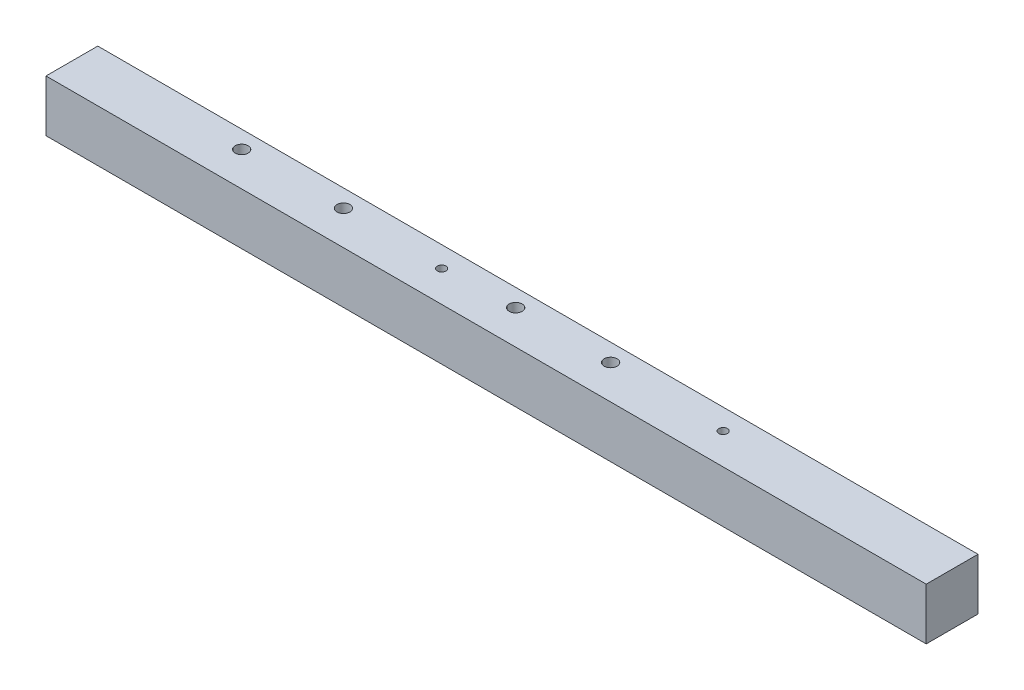
ISO-10303-21;
HEADER;
FILE_DESCRIPTION(('STEP AP214'),'2;1');
FILE_NAME('part.step','',(''),(''),'','','');
FILE_SCHEMA(('AUTOMOTIVE_DESIGN { 1 0 10303 214 1 1 1 1 }'));
ENDSEC;
DATA;
#1=APPLICATION_CONTEXT('core data for automotive mechanical design processes');
#2=APPLICATION_PROTOCOL_DEFINITION('international standard','automotive_design',2000,#1);
#3=PRODUCT_CONTEXT('',#1,'mechanical');
#4=PRODUCT('Part','Part','',(#3));
#5=PRODUCT_RELATED_PRODUCT_CATEGORY('part','',(#4));
#6=PRODUCT_DEFINITION_FORMATION('','',#4);
#7=PRODUCT_DEFINITION_CONTEXT('part definition',#1,'design');
#8=PRODUCT_DEFINITION('design','',#6,#7);
#9=PRODUCT_DEFINITION_SHAPE('','',#8);
#10=(LENGTH_UNIT() NAMED_UNIT(*) SI_UNIT(.MILLI.,.METRE.));
#11=(NAMED_UNIT(*) PLANE_ANGLE_UNIT() SI_UNIT($,.RADIAN.));
#12=(NAMED_UNIT(*) SI_UNIT($,.STERADIAN.) SOLID_ANGLE_UNIT());
#13=UNCERTAINTY_MEASURE_WITH_UNIT(LENGTH_MEASURE(1.E-05),#10,'distance_accuracy_value','');
#14=(GEOMETRIC_REPRESENTATION_CONTEXT(3) GLOBAL_UNCERTAINTY_ASSIGNED_CONTEXT((#13)) GLOBAL_UNIT_ASSIGNED_CONTEXT((#10,
#11,#12)) REPRESENTATION_CONTEXT('',''));
#15=CARTESIAN_POINT('',(0.,0.,0.));
#16=DIRECTION('',(0.,0.,1.));
#17=DIRECTION('',(1.,0.,0.));
#18=AXIS2_PLACEMENT_3D('',#15,#16,#17);
#19=CARTESIAN_POINT('',(0.,38.1,0.));
#20=DIRECTION('',(0.,-1.,0.));
#21=DIRECTION('',(0.,0.,-1.));
#22=AXIS2_PLACEMENT_3D('',#19,#20,#21);
#23=PLANE('',#22);
#24=DIRECTION('',(0.,0.,1.));
#25=VECTOR('',#24,1.);
#26=CARTESIAN_POINT('',(0.,38.1,0.));
#27=LINE('',#26,#25);
#28=CARTESIAN_POINT('',(0.,38.1,-38.1));
#29=VERTEX_POINT('',#28);
#30=CARTESIAN_POINT('',(0.,38.1,0.));
#31=VERTEX_POINT('',#30);
#32=EDGE_CURVE('E91',#29,#31,#27,.T.);
#33=ORIENTED_EDGE('',*,*,#32,.T.);
#34=DIRECTION('',(1.,0.,0.));
#35=VECTOR('',#34,1.);
#36=CARTESIAN_POINT('',(0.,38.1,0.));
#37=LINE('',#36,#35);
#38=CARTESIAN_POINT('',(647.7,38.1,0.));
#39=VERTEX_POINT('',#38);
#40=EDGE_CURVE('E86',#31,#39,#37,.T.);
#41=ORIENTED_EDGE('',*,*,#40,.T.);
#42=DIRECTION('',(0.,0.,-1.));
#43=VECTOR('',#42,1.);
#44=CARTESIAN_POINT('',(647.7,38.1,0.));
#45=LINE('',#44,#43);
#46=CARTESIAN_POINT('',(647.7,38.1,-38.1));
#47=VERTEX_POINT('',#46);
#48=EDGE_CURVE('E89',#39,#47,#45,.T.);
#49=ORIENTED_EDGE('',*,*,#48,.T.);
#50=DIRECTION('',(-1.,0.,0.));
#51=VECTOR('',#50,1.);
#52=CARTESIAN_POINT('',(0.,38.1,-38.1));
#53=LINE('',#52,#51);
#54=EDGE_CURVE('E56',#47,#29,#53,.T.);
#55=ORIENTED_EDGE('',*,*,#54,.T.);
#56=EDGE_LOOP('',(#33,#41,#49,#55));
#57=FACE_BOUND('',#56,.T.);
#58=CARTESIAN_POINT('',(118.802175491191,38.1,-25.146));
#59=DIRECTION('',(0.,1.,0.));
#60=DIRECTION('',(0.,0.,1.));
#61=AXIS2_PLACEMENT_3D('',#58,#59,#60);
#62=CIRCLE('',#61,4.7625);
#63=CARTESIAN_POINT('',(118.802175491191,38.1,-29.9085));
#64=VERTEX_POINT('',#63);
#65=EDGE_CURVE('E106',#64,#64,#62,.T.);
#66=ORIENTED_EDGE('',*,*,#65,.F.);
#67=EDGE_LOOP('',(#66));
#68=FACE_BOUND('',#67,.T.);
#69=CARTESIAN_POINT('',(193.732175491191,38.1,-25.146));
#70=DIRECTION('',(0.,1.,0.));
#71=DIRECTION('',(0.,0.,1.));
#72=AXIS2_PLACEMENT_3D('',#69,#70,#71);
#73=CIRCLE('',#72,4.76250000000001);
#74=CARTESIAN_POINT('',(193.732175491191,38.1,-29.9085));
#75=VERTEX_POINT('',#74);
#76=EDGE_CURVE('E121',#75,#75,#73,.T.);
#77=ORIENTED_EDGE('',*,*,#76,.F.);
#78=EDGE_LOOP('',(#77));
#79=FACE_BOUND('',#78,.T.);
#80=CARTESIAN_POINT('',(320.470555491191,38.1,-25.146));
#81=DIRECTION('',(0.,1.,0.));
#82=DIRECTION('',(0.,0.,1.));
#83=AXIS2_PLACEMENT_3D('',#80,#81,#82);
#84=CIRCLE('',#83,4.76250000000001);
#85=CARTESIAN_POINT('',(320.470555491191,38.1,-29.9085));
#86=VERTEX_POINT('',#85);
#87=EDGE_CURVE('E127',#86,#86,#84,.T.);
#88=ORIENTED_EDGE('',*,*,#87,.F.);
#89=EDGE_LOOP('',(#88));
#90=FACE_BOUND('',#89,.T.);
#91=CARTESIAN_POINT('',(390.320555491191,38.1,-25.146));
#92=DIRECTION('',(0.,1.,0.));
#93=DIRECTION('',(0.,0.,1.));
#94=AXIS2_PLACEMENT_3D('',#91,#92,#93);
#95=CIRCLE('',#94,4.76250000000001);
#96=CARTESIAN_POINT('',(390.320555491191,38.1,-29.9085));
#97=VERTEX_POINT('',#96);
#98=EDGE_CURVE('E133',#97,#97,#95,.T.);
#99=ORIENTED_EDGE('',*,*,#98,.F.);
#100=EDGE_LOOP('',(#99));
#101=FACE_BOUND('',#100,.T.);
#102=CARTESIAN_POINT('',(475.391073092,38.1,-22.8375768800001));
#103=DIRECTION('',(0.,1.,0.));
#104=DIRECTION('',(0.,0.,1.));
#105=AXIS2_PLACEMENT_3D('',#102,#103,#104);
#106=CIRCLE('',#105,3.17499999999997);
#107=CARTESIAN_POINT('',(475.391073092,38.1,-26.0125768800001));
#108=VERTEX_POINT('',#107);
#109=EDGE_CURVE('E139',#108,#108,#106,.T.);
#110=ORIENTED_EDGE('',*,*,#109,.F.);
#111=EDGE_LOOP('',(#110));
#112=FACE_BOUND('',#111,.T.);
#113=CARTESIAN_POINT('',(268.254073092,38.1,-22.83757688));
#114=DIRECTION('',(0.,1.,0.));
#115=DIRECTION('',(0.,0.,1.));
#116=AXIS2_PLACEMENT_3D('',#113,#114,#115);
#117=CIRCLE('',#116,3.17499999999997);
#118=CARTESIAN_POINT('',(268.254073092,38.1,-26.01257688));
#119=VERTEX_POINT('',#118);
#120=EDGE_CURVE('E145',#119,#119,#117,.T.);
#121=ORIENTED_EDGE('',*,*,#120,.F.);
#122=EDGE_LOOP('',(#121));
#123=FACE_BOUND('',#122,.T.);
#124=ADVANCED_FACE('F39',(#57,#68,#79,#90,#101,#112,#123),#23,.F.);
#125=CARTESIAN_POINT('',(0.,0.,0.));
#126=DIRECTION('',(0.,-1.,0.));
#127=DIRECTION('',(0.,0.,-1.));
#128=AXIS2_PLACEMENT_3D('',#125,#126,#127);
#129=PLANE('',#128);
#130=CARTESIAN_POINT('',(475.391073092,0.,-22.8375768800001));
#131=DIRECTION('',(0.,1.,0.));
#132=DIRECTION('',(0.,0.,1.));
#133=AXIS2_PLACEMENT_3D('',#130,#131,#132);
#134=CIRCLE('',#133,3.17499999999997);
#135=CARTESIAN_POINT('',(475.391073092,0.,-26.0125768800001));
#136=VERTEX_POINT('',#135);
#137=EDGE_CURVE('E142',#136,#136,#134,.T.);
#138=ORIENTED_EDGE('',*,*,#137,.T.);
#139=EDGE_LOOP('',(#138));
#140=FACE_BOUND('',#139,.T.);
#141=CARTESIAN_POINT('',(320.470555491191,0.,-25.146));
#142=DIRECTION('',(0.,1.,0.));
#143=DIRECTION('',(0.,0.,1.));
#144=AXIS2_PLACEMENT_3D('',#141,#142,#143);
#145=CIRCLE('',#144,4.76250000000001);
#146=CARTESIAN_POINT('',(320.470555491191,0.,-29.9085));
#147=VERTEX_POINT('',#146);
#148=EDGE_CURVE('E130',#147,#147,#145,.T.);
#149=ORIENTED_EDGE('',*,*,#148,.T.);
#150=EDGE_LOOP('',(#149));
#151=FACE_BOUND('',#150,.T.);
#152=CARTESIAN_POINT('',(118.802175491191,0.,-25.146));
#153=DIRECTION('',(0.,1.,0.));
#154=DIRECTION('',(0.,0.,1.));
#155=AXIS2_PLACEMENT_3D('',#152,#153,#154);
#156=CIRCLE('',#155,4.7625);
#157=CARTESIAN_POINT('',(118.802175491191,0.,-29.9085));
#158=VERTEX_POINT('',#157);
#159=EDGE_CURVE('E118',#158,#158,#156,.T.);
#160=ORIENTED_EDGE('',*,*,#159,.T.);
#161=EDGE_LOOP('',(#160));
#162=FACE_BOUND('',#161,.T.);
#163=DIRECTION('',(0.,0.,1.));
#164=VECTOR('',#163,1.);
#165=CARTESIAN_POINT('',(0.,0.,0.));
#166=LINE('',#165,#164);
#167=CARTESIAN_POINT('',(0.,0.,-38.1));
#168=VERTEX_POINT('',#167);
#169=CARTESIAN_POINT('',(0.,0.,0.));
#170=VERTEX_POINT('',#169);
#171=EDGE_CURVE('E103',#168,#170,#166,.T.);
#172=ORIENTED_EDGE('',*,*,#171,.F.);
#173=DIRECTION('',(-1.,0.,0.));
#174=VECTOR('',#173,1.);
#175=CARTESIAN_POINT('',(0.,0.,-38.1));
#176=LINE('',#175,#174);
#177=CARTESIAN_POINT('',(647.7,0.,-38.1));
#178=VERTEX_POINT('',#177);
#179=EDGE_CURVE('E79',#178,#168,#176,.T.);
#180=ORIENTED_EDGE('',*,*,#179,.F.);
#181=DIRECTION('',(0.,0.,-1.));
#182=VECTOR('',#181,1.);
#183=CARTESIAN_POINT('',(647.7,0.,0.));
#184=LINE('',#183,#182);
#185=CARTESIAN_POINT('',(647.7,0.,0.));
#186=VERTEX_POINT('',#185);
#187=EDGE_CURVE('E73',#186,#178,#184,.T.);
#188=ORIENTED_EDGE('',*,*,#187,.F.);
#189=DIRECTION('',(1.,0.,0.));
#190=VECTOR('',#189,1.);
#191=CARTESIAN_POINT('',(0.,0.,0.));
#192=LINE('',#191,#190);
#193=EDGE_CURVE('E95',#170,#186,#192,.T.);
#194=ORIENTED_EDGE('',*,*,#193,.F.);
#195=EDGE_LOOP('',(#172,#180,#188,#194));
#196=FACE_BOUND('',#195,.T.);
#197=CARTESIAN_POINT('',(193.732175491191,0.,-25.146));
#198=DIRECTION('',(0.,1.,0.));
#199=DIRECTION('',(0.,0.,1.));
#200=AXIS2_PLACEMENT_3D('',#197,#198,#199);
#201=CIRCLE('',#200,4.76250000000001);
#202=CARTESIAN_POINT('',(193.732175491191,0.,-29.9085));
#203=VERTEX_POINT('',#202);
#204=EDGE_CURVE('E124',#203,#203,#201,.T.);
#205=ORIENTED_EDGE('',*,*,#204,.T.);
#206=EDGE_LOOP('',(#205));
#207=FACE_BOUND('',#206,.T.);
#208=CARTESIAN_POINT('',(390.320555491191,0.,-25.146));
#209=DIRECTION('',(0.,1.,0.));
#210=DIRECTION('',(0.,0.,1.));
#211=AXIS2_PLACEMENT_3D('',#208,#209,#210);
#212=CIRCLE('',#211,4.76250000000001);
#213=CARTESIAN_POINT('',(390.320555491191,0.,-29.9085));
#214=VERTEX_POINT('',#213);
#215=EDGE_CURVE('E136',#214,#214,#212,.T.);
#216=ORIENTED_EDGE('',*,*,#215,.T.);
#217=EDGE_LOOP('',(#216));
#218=FACE_BOUND('',#217,.T.);
#219=CARTESIAN_POINT('',(268.254073092,0.,-22.83757688));
#220=DIRECTION('',(0.,1.,0.));
#221=DIRECTION('',(0.,0.,1.));
#222=AXIS2_PLACEMENT_3D('',#219,#220,#221);
#223=CIRCLE('',#222,3.17499999999997);
#224=CARTESIAN_POINT('',(268.254073092,0.,-26.01257688));
#225=VERTEX_POINT('',#224);
#226=EDGE_CURVE('E148',#225,#225,#223,.T.);
#227=ORIENTED_EDGE('',*,*,#226,.T.);
#228=EDGE_LOOP('',(#227));
#229=FACE_BOUND('',#228,.T.);
#230=ADVANCED_FACE('F114',(#140,#151,#162,#196,#207,#218,#229),#129,.T.);
#231=CARTESIAN_POINT('',(0.,38.1,0.));
#232=DIRECTION('',(1.,0.,0.));
#233=DIRECTION('',(0.,0.,-1.));
#234=AXIS2_PLACEMENT_3D('',#231,#232,#233);
#235=PLANE('',#234);
#236=ORIENTED_EDGE('',*,*,#171,.T.);
#237=DIRECTION('',(0.,-1.,0.));
#238=VECTOR('',#237,1.);
#239=CARTESIAN_POINT('',(0.,38.1,0.));
#240=LINE('',#239,#238);
#241=EDGE_CURVE('E11',#31,#170,#240,.T.);
#242=ORIENTED_EDGE('',*,*,#241,.F.);
#243=ORIENTED_EDGE('',*,*,#32,.F.);
#244=DIRECTION('',(0.,-1.,0.));
#245=VECTOR('',#244,1.);
#246=CARTESIAN_POINT('',(0.,38.1,-38.1));
#247=LINE('',#246,#245);
#248=EDGE_CURVE('E99',#29,#168,#247,.T.);
#249=ORIENTED_EDGE('',*,*,#248,.T.);
#250=EDGE_LOOP('',(#236,#242,#243,#249));
#251=FACE_BOUND('',#250,.T.);
#252=ADVANCED_FACE('F41',(#251),#235,.F.);
#253=CARTESIAN_POINT('',(0.,38.1,0.));
#254=DIRECTION('',(0.,0.,-1.));
#255=DIRECTION('',(-1.,0.,0.));
#256=AXIS2_PLACEMENT_3D('',#253,#254,#255);
#257=PLANE('',#256);
#258=ORIENTED_EDGE('',*,*,#193,.T.);
#259=DIRECTION('',(0.,-1.,0.));
#260=VECTOR('',#259,1.);
#261=CARTESIAN_POINT('',(647.7,38.1,0.));
#262=LINE('',#261,#260);
#263=EDGE_CURVE('E48',#39,#186,#262,.T.);
#264=ORIENTED_EDGE('',*,*,#263,.F.);
#265=ORIENTED_EDGE('',*,*,#40,.F.);
#266=ORIENTED_EDGE('',*,*,#241,.T.);
#267=EDGE_LOOP('',(#258,#264,#265,#266));
#268=FACE_BOUND('',#267,.T.);
#269=ADVANCED_FACE('F94',(#268),#257,.F.);
#270=CARTESIAN_POINT('',(647.7,38.1,0.));
#271=DIRECTION('',(-1.,0.,0.));
#272=DIRECTION('',(0.,0.,1.));
#273=AXIS2_PLACEMENT_3D('',#270,#271,#272);
#274=PLANE('',#273);
#275=ORIENTED_EDGE('',*,*,#187,.T.);
#276=DIRECTION('',(0.,-1.,0.));
#277=VECTOR('',#276,1.);
#278=CARTESIAN_POINT('',(647.7,38.1,-38.1));
#279=LINE('',#278,#277);
#280=EDGE_CURVE('E96',#47,#178,#279,.T.);
#281=ORIENTED_EDGE('',*,*,#280,.F.);
#282=ORIENTED_EDGE('',*,*,#48,.F.);
#283=ORIENTED_EDGE('',*,*,#263,.T.);
#284=EDGE_LOOP('',(#275,#281,#282,#283));
#285=FACE_BOUND('',#284,.T.);
#286=ADVANCED_FACE('F97',(#285),#274,.F.);
#287=CARTESIAN_POINT('',(0.,38.1,-38.1));
#288=DIRECTION('',(0.,0.,1.));
#289=DIRECTION('',(1.,0.,0.));
#290=AXIS2_PLACEMENT_3D('',#287,#288,#289);
#291=PLANE('',#290);
#292=ORIENTED_EDGE('',*,*,#179,.T.);
#293=ORIENTED_EDGE('',*,*,#248,.F.);
#294=ORIENTED_EDGE('',*,*,#54,.F.);
#295=ORIENTED_EDGE('',*,*,#280,.T.);
#296=EDGE_LOOP('',(#292,#293,#294,#295));
#297=FACE_BOUND('',#296,.T.);
#298=ADVANCED_FACE('F111',(#297),#291,.F.);
#299=CARTESIAN_POINT('',(118.802175491191,38.1,-25.146));
#300=DIRECTION('',(0.,-1.,0.));
#301=DIRECTION('',(0.,0.,-1.));
#302=AXIS2_PLACEMENT_3D('',#299,#300,#301);
#303=CYLINDRICAL_SURFACE('',#302,4.7625);
#304=CARTESIAN_POINT('',(118.802175491191,38.1,-29.9085));
#305=CARTESIAN_POINT('',(118.802175491191,37.703125,-29.9085));
#306=CARTESIAN_POINT('',(118.802175491191,37.30625,-29.9085));
#307=CARTESIAN_POINT('',(118.802175491191,36.5125,-29.9085));
#308=CARTESIAN_POINT('',(118.802175491191,36.115625,-29.9085));
#309=CARTESIAN_POINT('',(118.802175491191,35.321875,-29.9085));
#310=CARTESIAN_POINT('',(118.802175491191,34.925,-29.9085));
#311=CARTESIAN_POINT('',(118.802175491191,34.13125,-29.9085));
#312=CARTESIAN_POINT('',(118.802175491191,33.734375,-29.9085));
#313=CARTESIAN_POINT('',(118.802175491191,32.940625,-29.9085));
#314=CARTESIAN_POINT('',(118.802175491191,32.54375,-29.9085));
#315=CARTESIAN_POINT('',(118.802175491191,31.75,-29.9085));
#316=CARTESIAN_POINT('',(118.802175491191,31.353125,-29.9085));
#317=CARTESIAN_POINT('',(118.802175491191,30.559375,-29.9085));
#318=CARTESIAN_POINT('',(118.802175491191,30.1625,-29.9085));
#319=CARTESIAN_POINT('',(118.802175491191,29.36875,-29.9085));
#320=CARTESIAN_POINT('',(118.802175491191,28.971875,-29.9085));
#321=CARTESIAN_POINT('',(118.802175491191,28.178125,-29.9085));
#322=CARTESIAN_POINT('',(118.802175491191,27.78125,-29.9085));
#323=CARTESIAN_POINT('',(118.802175491191,26.9875,-29.9085));
#324=CARTESIAN_POINT('',(118.802175491191,26.590625,-29.9085));
#325=CARTESIAN_POINT('',(118.802175491191,25.796875,-29.9085));
#326=CARTESIAN_POINT('',(118.802175491191,25.4,-29.9085));
#327=CARTESIAN_POINT('',(118.802175491191,24.60625,-29.9085));
#328=CARTESIAN_POINT('',(118.802175491191,24.209375,-29.9085));
#329=CARTESIAN_POINT('',(118.802175491191,23.415625,-29.9085));
#330=CARTESIAN_POINT('',(118.802175491191,23.01875,-29.9085));
#331=CARTESIAN_POINT('',(118.802175491191,22.225,-29.9085));
#332=CARTESIAN_POINT('',(118.802175491191,21.828125,-29.9085));
#333=CARTESIAN_POINT('',(118.802175491191,21.034375,-29.9085));
#334=CARTESIAN_POINT('',(118.802175491191,20.6375,-29.9085));
#335=CARTESIAN_POINT('',(118.802175491191,19.84375,-29.9085));
#336=CARTESIAN_POINT('',(118.802175491191,19.446875,-29.9085));
#337=CARTESIAN_POINT('',(118.802175491191,18.653125,-29.9085));
#338=CARTESIAN_POINT('',(118.802175491191,18.25625,-29.9085));
#339=CARTESIAN_POINT('',(118.802175491191,17.4625,-29.9085));
#340=CARTESIAN_POINT('',(118.802175491191,17.065625,-29.9085));
#341=CARTESIAN_POINT('',(118.802175491191,16.271875,-29.9085));
#342=CARTESIAN_POINT('',(118.802175491191,15.875,-29.9085));
#343=CARTESIAN_POINT('',(118.802175491191,15.08125,-29.9085));
#344=CARTESIAN_POINT('',(118.802175491191,14.684375,-29.9085));
#345=CARTESIAN_POINT('',(118.802175491191,13.890625,-29.9085));
#346=CARTESIAN_POINT('',(118.802175491191,13.49375,-29.9085));
#347=CARTESIAN_POINT('',(118.802175491191,12.7,-29.9085));
#348=CARTESIAN_POINT('',(118.802175491191,12.303125,-29.9085));
#349=CARTESIAN_POINT('',(118.802175491191,11.509375,-29.9085));
#350=CARTESIAN_POINT('',(118.802175491191,11.1125,-29.9085));
#351=CARTESIAN_POINT('',(118.802175491191,10.31875,-29.9085));
#352=CARTESIAN_POINT('',(118.802175491191,9.92187499999999,-29.9085));
#353=CARTESIAN_POINT('',(118.802175491191,9.128125,-29.9085));
#354=CARTESIAN_POINT('',(118.802175491191,8.73124999999999,-29.9085));
#355=CARTESIAN_POINT('',(118.802175491191,7.93749999999999,-29.9085));
#356=CARTESIAN_POINT('',(118.802175491191,7.54062499999999,-29.9085));
#357=CARTESIAN_POINT('',(118.802175491191,6.746875,-29.9085));
#358=CARTESIAN_POINT('',(118.802175491191,6.35,-29.9085));
#359=CARTESIAN_POINT('',(118.802175491191,5.55625,-29.9085));
#360=CARTESIAN_POINT('',(118.802175491191,5.159375,-29.9085));
#361=CARTESIAN_POINT('',(118.802175491191,4.365625,-29.9085));
#362=CARTESIAN_POINT('',(118.802175491191,3.96875,-29.9085));
#363=CARTESIAN_POINT('',(118.802175491191,3.175,-29.9085));
#364=CARTESIAN_POINT('',(118.802175491191,2.778125,-29.9085));
#365=CARTESIAN_POINT('',(118.802175491191,1.984375,-29.9085));
#366=CARTESIAN_POINT('',(118.802175491191,1.5875,-29.9085));
#367=CARTESIAN_POINT('',(118.802175491191,0.79375,-29.9085));
#368=CARTESIAN_POINT('',(118.802175491191,0.396875,-29.9085));
#369=CARTESIAN_POINT('',(118.802175491191,0.,-29.9085));
#370=B_SPLINE_CURVE_WITH_KNOTS('',3,(#304,#305,#306,#307,#308,#309,#310,#311,#312,#313,#314,
#315,#316,#317,#318,#319,#320,#321,#322,#323,#324,#325,#326,#327,#328,#329,#330,#331,#332,#333,
#334,#335,#336,#337,#338,#339,#340,#341,#342,#343,#344,#345,#346,#347,#348,#349,#350,#351,#352,
#353,#354,#355,#356,#357,#358,#359,#360,#361,#362,#363,#364,#365,#366,#367,#368,#369),
.UNSPECIFIED.,.F.,.F.,(4,2,2,2,2,2,2,2,2,2,2,2,2,2,2,2,2,2,2,2,2,2,2,2,2,2,2,2,2,2,2,2,4),(0.,
1.190625,2.38125,3.571875,4.7625,5.953125,7.14375,8.334375,9.52500000000001,10.715625,11.90625,
13.096875,14.2875,15.478125,16.66875,17.859375,19.05,20.240625,21.43125,22.621875,23.8125,
25.003125,26.19375,27.384375,28.575,29.765625,30.95625,32.146875,33.3375,34.528125,35.71875,
36.909375,38.1),.UNSPECIFIED.);
#371=EDGE_CURVE('BSEAM165',#64,#158,#370,.T.);
#372=ORIENTED_EDGE('',*,*,#65,.T.);
#373=ORIENTED_EDGE('',*,*,#159,.F.);
#374=ORIENTED_EDGE('',*,*,#371,.T.);
#375=ORIENTED_EDGE('',*,*,#371,.F.);
#376=EDGE_LOOP('',(#372,#374,#373,#375));
#377=FACE_BOUND('',#376,.T.);
#378=ADVANCED_FACE('F165',(#377),#303,.F.);
#379=CARTESIAN_POINT('',(193.732175491191,38.1,-25.146));
#380=DIRECTION('',(0.,-1.,0.));
#381=DIRECTION('',(0.,0.,-1.));
#382=AXIS2_PLACEMENT_3D('',#379,#380,#381);
#383=CYLINDRICAL_SURFACE('',#382,4.76250000000001);
#384=CARTESIAN_POINT('',(193.732175491191,38.1,-29.9085));
#385=CARTESIAN_POINT('',(193.732175491191,37.703125,-29.9085));
#386=CARTESIAN_POINT('',(193.732175491191,37.30625,-29.9085));
#387=CARTESIAN_POINT('',(193.732175491191,36.5125,-29.9085));
#388=CARTESIAN_POINT('',(193.732175491191,36.115625,-29.9085));
#389=CARTESIAN_POINT('',(193.732175491191,35.321875,-29.9085));
#390=CARTESIAN_POINT('',(193.732175491191,34.925,-29.9085));
#391=CARTESIAN_POINT('',(193.732175491191,34.13125,-29.9085));
#392=CARTESIAN_POINT('',(193.732175491191,33.734375,-29.9085));
#393=CARTESIAN_POINT('',(193.732175491191,32.940625,-29.9085));
#394=CARTESIAN_POINT('',(193.732175491191,32.54375,-29.9085));
#395=CARTESIAN_POINT('',(193.732175491191,31.75,-29.9085));
#396=CARTESIAN_POINT('',(193.732175491191,31.353125,-29.9085));
#397=CARTESIAN_POINT('',(193.732175491191,30.559375,-29.9085));
#398=CARTESIAN_POINT('',(193.732175491191,30.1625,-29.9085));
#399=CARTESIAN_POINT('',(193.732175491191,29.36875,-29.9085));
#400=CARTESIAN_POINT('',(193.732175491191,28.971875,-29.9085));
#401=CARTESIAN_POINT('',(193.732175491191,28.178125,-29.9085));
#402=CARTESIAN_POINT('',(193.732175491191,27.78125,-29.9085));
#403=CARTESIAN_POINT('',(193.732175491191,26.9875,-29.9085));
#404=CARTESIAN_POINT('',(193.732175491191,26.590625,-29.9085));
#405=CARTESIAN_POINT('',(193.732175491191,25.796875,-29.9085));
#406=CARTESIAN_POINT('',(193.732175491191,25.4,-29.9085));
#407=CARTESIAN_POINT('',(193.732175491191,24.60625,-29.9085));
#408=CARTESIAN_POINT('',(193.732175491191,24.209375,-29.9085));
#409=CARTESIAN_POINT('',(193.732175491191,23.415625,-29.9085));
#410=CARTESIAN_POINT('',(193.732175491191,23.01875,-29.9085));
#411=CARTESIAN_POINT('',(193.732175491191,22.225,-29.9085));
#412=CARTESIAN_POINT('',(193.732175491191,21.828125,-29.9085));
#413=CARTESIAN_POINT('',(193.732175491191,21.034375,-29.9085));
#414=CARTESIAN_POINT('',(193.732175491191,20.6375,-29.9085));
#415=CARTESIAN_POINT('',(193.732175491191,19.84375,-29.9085));
#416=CARTESIAN_POINT('',(193.732175491191,19.446875,-29.9085));
#417=CARTESIAN_POINT('',(193.732175491191,18.653125,-29.9085));
#418=CARTESIAN_POINT('',(193.732175491191,18.25625,-29.9085));
#419=CARTESIAN_POINT('',(193.732175491191,17.4625,-29.9085));
#420=CARTESIAN_POINT('',(193.732175491191,17.065625,-29.9085));
#421=CARTESIAN_POINT('',(193.732175491191,16.271875,-29.9085));
#422=CARTESIAN_POINT('',(193.732175491191,15.875,-29.9085));
#423=CARTESIAN_POINT('',(193.732175491191,15.08125,-29.9085));
#424=CARTESIAN_POINT('',(193.732175491191,14.684375,-29.9085));
#425=CARTESIAN_POINT('',(193.732175491191,13.890625,-29.9085));
#426=CARTESIAN_POINT('',(193.732175491191,13.49375,-29.9085));
#427=CARTESIAN_POINT('',(193.732175491191,12.7,-29.9085));
#428=CARTESIAN_POINT('',(193.732175491191,12.303125,-29.9085));
#429=CARTESIAN_POINT('',(193.732175491191,11.509375,-29.9085));
#430=CARTESIAN_POINT('',(193.732175491191,11.1125,-29.9085));
#431=CARTESIAN_POINT('',(193.732175491191,10.31875,-29.9085));
#432=CARTESIAN_POINT('',(193.732175491191,9.92187499999999,-29.9085));
#433=CARTESIAN_POINT('',(193.732175491191,9.128125,-29.9085));
#434=CARTESIAN_POINT('',(193.732175491191,8.73124999999999,-29.9085));
#435=CARTESIAN_POINT('',(193.732175491191,7.93749999999999,-29.9085));
#436=CARTESIAN_POINT('',(193.732175491191,7.54062499999999,-29.9085));
#437=CARTESIAN_POINT('',(193.732175491191,6.746875,-29.9085));
#438=CARTESIAN_POINT('',(193.732175491191,6.35,-29.9085));
#439=CARTESIAN_POINT('',(193.732175491191,5.55625,-29.9085));
#440=CARTESIAN_POINT('',(193.732175491191,5.159375,-29.9085));
#441=CARTESIAN_POINT('',(193.732175491191,4.365625,-29.9085));
#442=CARTESIAN_POINT('',(193.732175491191,3.96875,-29.9085));
#443=CARTESIAN_POINT('',(193.732175491191,3.175,-29.9085));
#444=CARTESIAN_POINT('',(193.732175491191,2.778125,-29.9085));
#445=CARTESIAN_POINT('',(193.732175491191,1.984375,-29.9085));
#446=CARTESIAN_POINT('',(193.732175491191,1.5875,-29.9085));
#447=CARTESIAN_POINT('',(193.732175491191,0.79375,-29.9085));
#448=CARTESIAN_POINT('',(193.732175491191,0.396875,-29.9085));
#449=CARTESIAN_POINT('',(193.732175491191,0.,-29.9085));
#450=B_SPLINE_CURVE_WITH_KNOTS('',3,(#384,#385,#386,#387,#388,#389,#390,#391,#392,#393,#394,
#395,#396,#397,#398,#399,#400,#401,#402,#403,#404,#405,#406,#407,#408,#409,#410,#411,#412,#413,
#414,#415,#416,#417,#418,#419,#420,#421,#422,#423,#424,#425,#426,#427,#428,#429,#430,#431,#432,
#433,#434,#435,#436,#437,#438,#439,#440,#441,#442,#443,#444,#445,#446,#447,#448,#449),
.UNSPECIFIED.,.F.,.F.,(4,2,2,2,2,2,2,2,2,2,2,2,2,2,2,2,2,2,2,2,2,2,2,2,2,2,2,2,2,2,2,2,4),(0.,
1.190625,2.38125,3.571875,4.7625,5.953125,7.14375,8.334375,9.52500000000001,10.715625,11.90625,
13.096875,14.2875,15.478125,16.66875,17.859375,19.05,20.240625,21.43125,22.621875,23.8125,
25.003125,26.19375,27.384375,28.575,29.765625,30.95625,32.146875,33.3375,34.528125,35.71875,
36.909375,38.1),.UNSPECIFIED.);
#451=EDGE_CURVE('BSEAM210',#75,#203,#450,.T.);
#452=ORIENTED_EDGE('',*,*,#76,.T.);
#453=ORIENTED_EDGE('',*,*,#204,.F.);
#454=ORIENTED_EDGE('',*,*,#451,.T.);
#455=ORIENTED_EDGE('',*,*,#451,.F.);
#456=EDGE_LOOP('',(#452,#454,#453,#455));
#457=FACE_BOUND('',#456,.T.);
#458=ADVANCED_FACE('F210',(#457),#383,.F.);
#459=CARTESIAN_POINT('',(320.470555491191,38.1,-25.146));
#460=DIRECTION('',(0.,-1.,0.));
#461=DIRECTION('',(0.,0.,-1.));
#462=AXIS2_PLACEMENT_3D('',#459,#460,#461);
#463=CYLINDRICAL_SURFACE('',#462,4.76250000000001);
#464=CARTESIAN_POINT('',(320.470555491191,38.1,-29.9085));
#465=CARTESIAN_POINT('',(320.470555491191,37.703125,-29.9085));
#466=CARTESIAN_POINT('',(320.470555491191,37.30625,-29.9085));
#467=CARTESIAN_POINT('',(320.470555491191,36.5125,-29.9085));
#468=CARTESIAN_POINT('',(320.470555491191,36.115625,-29.9085));
#469=CARTESIAN_POINT('',(320.470555491191,35.321875,-29.9085));
#470=CARTESIAN_POINT('',(320.470555491191,34.925,-29.9085));
#471=CARTESIAN_POINT('',(320.470555491191,34.13125,-29.9085));
#472=CARTESIAN_POINT('',(320.470555491191,33.734375,-29.9085));
#473=CARTESIAN_POINT('',(320.470555491191,32.940625,-29.9085));
#474=CARTESIAN_POINT('',(320.470555491191,32.54375,-29.9085));
#475=CARTESIAN_POINT('',(320.470555491191,31.75,-29.9085));
#476=CARTESIAN_POINT('',(320.470555491191,31.353125,-29.9085));
#477=CARTESIAN_POINT('',(320.470555491191,30.559375,-29.9085));
#478=CARTESIAN_POINT('',(320.470555491191,30.1625,-29.9085));
#479=CARTESIAN_POINT('',(320.470555491191,29.36875,-29.9085));
#480=CARTESIAN_POINT('',(320.470555491191,28.971875,-29.9085));
#481=CARTESIAN_POINT('',(320.470555491191,28.178125,-29.9085));
#482=CARTESIAN_POINT('',(320.470555491191,27.78125,-29.9085));
#483=CARTESIAN_POINT('',(320.470555491191,26.9875,-29.9085));
#484=CARTESIAN_POINT('',(320.470555491191,26.590625,-29.9085));
#485=CARTESIAN_POINT('',(320.470555491191,25.796875,-29.9085));
#486=CARTESIAN_POINT('',(320.470555491191,25.4,-29.9085));
#487=CARTESIAN_POINT('',(320.470555491191,24.60625,-29.9085));
#488=CARTESIAN_POINT('',(320.470555491191,24.209375,-29.9085));
#489=CARTESIAN_POINT('',(320.470555491191,23.415625,-29.9085));
#490=CARTESIAN_POINT('',(320.470555491191,23.01875,-29.9085));
#491=CARTESIAN_POINT('',(320.470555491191,22.225,-29.9085));
#492=CARTESIAN_POINT('',(320.470555491191,21.828125,-29.9085));
#493=CARTESIAN_POINT('',(320.470555491191,21.034375,-29.9085));
#494=CARTESIAN_POINT('',(320.470555491191,20.6375,-29.9085));
#495=CARTESIAN_POINT('',(320.470555491191,19.84375,-29.9085));
#496=CARTESIAN_POINT('',(320.470555491191,19.446875,-29.9085));
#497=CARTESIAN_POINT('',(320.470555491191,18.653125,-29.9085));
#498=CARTESIAN_POINT('',(320.470555491191,18.25625,-29.9085));
#499=CARTESIAN_POINT('',(320.470555491191,17.4625,-29.9085));
#500=CARTESIAN_POINT('',(320.470555491191,17.065625,-29.9085));
#501=CARTESIAN_POINT('',(320.470555491191,16.271875,-29.9085));
#502=CARTESIAN_POINT('',(320.470555491191,15.875,-29.9085));
#503=CARTESIAN_POINT('',(320.470555491191,15.08125,-29.9085));
#504=CARTESIAN_POINT('',(320.470555491191,14.684375,-29.9085));
#505=CARTESIAN_POINT('',(320.470555491191,13.890625,-29.9085));
#506=CARTESIAN_POINT('',(320.470555491191,13.49375,-29.9085));
#507=CARTESIAN_POINT('',(320.470555491191,12.7,-29.9085));
#508=CARTESIAN_POINT('',(320.470555491191,12.303125,-29.9085));
#509=CARTESIAN_POINT('',(320.470555491191,11.509375,-29.9085));
#510=CARTESIAN_POINT('',(320.470555491191,11.1125,-29.9085));
#511=CARTESIAN_POINT('',(320.470555491191,10.31875,-29.9085));
#512=CARTESIAN_POINT('',(320.470555491191,9.92187499999999,-29.9085));
#513=CARTESIAN_POINT('',(320.470555491191,9.128125,-29.9085));
#514=CARTESIAN_POINT('',(320.470555491191,8.73124999999999,-29.9085));
#515=CARTESIAN_POINT('',(320.470555491191,7.93749999999999,-29.9085));
#516=CARTESIAN_POINT('',(320.470555491191,7.54062499999999,-29.9085));
#517=CARTESIAN_POINT('',(320.470555491191,6.746875,-29.9085));
#518=CARTESIAN_POINT('',(320.470555491191,6.35,-29.9085));
#519=CARTESIAN_POINT('',(320.470555491191,5.55625,-29.9085));
#520=CARTESIAN_POINT('',(320.470555491191,5.159375,-29.9085));
#521=CARTESIAN_POINT('',(320.470555491191,4.365625,-29.9085));
#522=CARTESIAN_POINT('',(320.470555491191,3.96875,-29.9085));
#523=CARTESIAN_POINT('',(320.470555491191,3.175,-29.9085));
#524=CARTESIAN_POINT('',(320.470555491191,2.778125,-29.9085));
#525=CARTESIAN_POINT('',(320.470555491191,1.984375,-29.9085));
#526=CARTESIAN_POINT('',(320.470555491191,1.5875,-29.9085));
#527=CARTESIAN_POINT('',(320.470555491191,0.79375,-29.9085));
#528=CARTESIAN_POINT('',(320.470555491191,0.396875,-29.9085));
#529=CARTESIAN_POINT('',(320.470555491191,0.,-29.9085));
#530=B_SPLINE_CURVE_WITH_KNOTS('',3,(#464,#465,#466,#467,#468,#469,#470,#471,#472,#473,#474,
#475,#476,#477,#478,#479,#480,#481,#482,#483,#484,#485,#486,#487,#488,#489,#490,#491,#492,#493,
#494,#495,#496,#497,#498,#499,#500,#501,#502,#503,#504,#505,#506,#507,#508,#509,#510,#511,#512,
#513,#514,#515,#516,#517,#518,#519,#520,#521,#522,#523,#524,#525,#526,#527,#528,#529),
.UNSPECIFIED.,.F.,.F.,(4,2,2,2,2,2,2,2,2,2,2,2,2,2,2,2,2,2,2,2,2,2,2,2,2,2,2,2,2,2,2,2,4),(0.,
1.190625,2.38125,3.571875,4.7625,5.953125,7.14375,8.334375,9.52500000000001,10.715625,11.90625,
13.096875,14.2875,15.478125,16.66875,17.859375,19.05,20.240625,21.43125,22.621875,23.8125,
25.003125,26.19375,27.384375,28.575,29.765625,30.95625,32.146875,33.3375,34.528125,35.71875,
36.909375,38.1),.UNSPECIFIED.);
#531=EDGE_CURVE('BSEAM218',#86,#147,#530,.T.);
#532=ORIENTED_EDGE('',*,*,#87,.T.);
#533=ORIENTED_EDGE('',*,*,#148,.F.);
#534=ORIENTED_EDGE('',*,*,#531,.T.);
#535=ORIENTED_EDGE('',*,*,#531,.F.);
#536=EDGE_LOOP('',(#532,#534,#533,#535));
#537=FACE_BOUND('',#536,.T.);
#538=ADVANCED_FACE('F218',(#537),#463,.F.);
#539=CARTESIAN_POINT('',(390.320555491191,38.1,-25.146));
#540=DIRECTION('',(0.,-1.,0.));
#541=DIRECTION('',(0.,0.,-1.));
#542=AXIS2_PLACEMENT_3D('',#539,#540,#541);
#543=CYLINDRICAL_SURFACE('',#542,4.76250000000001);
#544=CARTESIAN_POINT('',(390.320555491191,38.1,-29.9085));
#545=CARTESIAN_POINT('',(390.320555491191,37.703125,-29.9085));
#546=CARTESIAN_POINT('',(390.320555491191,37.30625,-29.9085));
#547=CARTESIAN_POINT('',(390.320555491191,36.5125,-29.9085));
#548=CARTESIAN_POINT('',(390.320555491191,36.115625,-29.9085));
#549=CARTESIAN_POINT('',(390.320555491191,35.321875,-29.9085));
#550=CARTESIAN_POINT('',(390.320555491191,34.925,-29.9085));
#551=CARTESIAN_POINT('',(390.320555491191,34.13125,-29.9085));
#552=CARTESIAN_POINT('',(390.320555491191,33.734375,-29.9085));
#553=CARTESIAN_POINT('',(390.320555491191,32.940625,-29.9085));
#554=CARTESIAN_POINT('',(390.320555491191,32.54375,-29.9085));
#555=CARTESIAN_POINT('',(390.320555491191,31.75,-29.9085));
#556=CARTESIAN_POINT('',(390.320555491191,31.353125,-29.9085));
#557=CARTESIAN_POINT('',(390.320555491191,30.559375,-29.9085));
#558=CARTESIAN_POINT('',(390.320555491191,30.1625,-29.9085));
#559=CARTESIAN_POINT('',(390.320555491191,29.36875,-29.9085));
#560=CARTESIAN_POINT('',(390.320555491191,28.971875,-29.9085));
#561=CARTESIAN_POINT('',(390.320555491191,28.178125,-29.9085));
#562=CARTESIAN_POINT('',(390.320555491191,27.78125,-29.9085));
#563=CARTESIAN_POINT('',(390.320555491191,26.9875,-29.9085));
#564=CARTESIAN_POINT('',(390.320555491191,26.590625,-29.9085));
#565=CARTESIAN_POINT('',(390.320555491191,25.796875,-29.9085));
#566=CARTESIAN_POINT('',(390.320555491191,25.4,-29.9085));
#567=CARTESIAN_POINT('',(390.320555491191,24.60625,-29.9085));
#568=CARTESIAN_POINT('',(390.320555491191,24.209375,-29.9085));
#569=CARTESIAN_POINT('',(390.320555491191,23.415625,-29.9085));
#570=CARTESIAN_POINT('',(390.320555491191,23.01875,-29.9085));
#571=CARTESIAN_POINT('',(390.320555491191,22.225,-29.9085));
#572=CARTESIAN_POINT('',(390.320555491191,21.828125,-29.9085));
#573=CARTESIAN_POINT('',(390.320555491191,21.034375,-29.9085));
#574=CARTESIAN_POINT('',(390.320555491191,20.6375,-29.9085));
#575=CARTESIAN_POINT('',(390.320555491191,19.84375,-29.9085));
#576=CARTESIAN_POINT('',(390.320555491191,19.446875,-29.9085));
#577=CARTESIAN_POINT('',(390.320555491191,18.653125,-29.9085));
#578=CARTESIAN_POINT('',(390.320555491191,18.25625,-29.9085));
#579=CARTESIAN_POINT('',(390.320555491191,17.4625,-29.9085));
#580=CARTESIAN_POINT('',(390.320555491191,17.065625,-29.9085));
#581=CARTESIAN_POINT('',(390.320555491191,16.271875,-29.9085));
#582=CARTESIAN_POINT('',(390.320555491191,15.875,-29.9085));
#583=CARTESIAN_POINT('',(390.320555491191,15.08125,-29.9085));
#584=CARTESIAN_POINT('',(390.320555491191,14.684375,-29.9085));
#585=CARTESIAN_POINT('',(390.320555491191,13.890625,-29.9085));
#586=CARTESIAN_POINT('',(390.320555491191,13.49375,-29.9085));
#587=CARTESIAN_POINT('',(390.320555491191,12.7,-29.9085));
#588=CARTESIAN_POINT('',(390.320555491191,12.303125,-29.9085));
#589=CARTESIAN_POINT('',(390.320555491191,11.509375,-29.9085));
#590=CARTESIAN_POINT('',(390.320555491191,11.1125,-29.9085));
#591=CARTESIAN_POINT('',(390.320555491191,10.31875,-29.9085));
#592=CARTESIAN_POINT('',(390.320555491191,9.92187499999999,-29.9085));
#593=CARTESIAN_POINT('',(390.320555491191,9.128125,-29.9085));
#594=CARTESIAN_POINT('',(390.320555491191,8.73124999999999,-29.9085));
#595=CARTESIAN_POINT('',(390.320555491191,7.93749999999999,-29.9085));
#596=CARTESIAN_POINT('',(390.320555491191,7.54062499999999,-29.9085));
#597=CARTESIAN_POINT('',(390.320555491191,6.746875,-29.9085));
#598=CARTESIAN_POINT('',(390.320555491191,6.35,-29.9085));
#599=CARTESIAN_POINT('',(390.320555491191,5.55625,-29.9085));
#600=CARTESIAN_POINT('',(390.320555491191,5.159375,-29.9085));
#601=CARTESIAN_POINT('',(390.320555491191,4.365625,-29.9085));
#602=CARTESIAN_POINT('',(390.320555491191,3.96875,-29.9085));
#603=CARTESIAN_POINT('',(390.320555491191,3.175,-29.9085));
#604=CARTESIAN_POINT('',(390.320555491191,2.778125,-29.9085));
#605=CARTESIAN_POINT('',(390.320555491191,1.984375,-29.9085));
#606=CARTESIAN_POINT('',(390.320555491191,1.5875,-29.9085));
#607=CARTESIAN_POINT('',(390.320555491191,0.79375,-29.9085));
#608=CARTESIAN_POINT('',(390.320555491191,0.396875,-29.9085));
#609=CARTESIAN_POINT('',(390.320555491191,0.,-29.9085));
#610=B_SPLINE_CURVE_WITH_KNOTS('',3,(#544,#545,#546,#547,#548,#549,#550,#551,#552,#553,#554,
#555,#556,#557,#558,#559,#560,#561,#562,#563,#564,#565,#566,#567,#568,#569,#570,#571,#572,#573,
#574,#575,#576,#577,#578,#579,#580,#581,#582,#583,#584,#585,#586,#587,#588,#589,#590,#591,#592,
#593,#594,#595,#596,#597,#598,#599,#600,#601,#602,#603,#604,#605,#606,#607,#608,#609),
.UNSPECIFIED.,.F.,.F.,(4,2,2,2,2,2,2,2,2,2,2,2,2,2,2,2,2,2,2,2,2,2,2,2,2,2,2,2,2,2,2,2,4),(0.,
1.190625,2.38125,3.571875,4.7625,5.953125,7.14375,8.334375,9.52500000000001,10.715625,11.90625,
13.096875,14.2875,15.478125,16.66875,17.859375,19.05,20.240625,21.43125,22.621875,23.8125,
25.003125,26.19375,27.384375,28.575,29.765625,30.95625,32.146875,33.3375,34.528125,35.71875,
36.909375,38.1),.UNSPECIFIED.);
#611=EDGE_CURVE('BSEAM226',#97,#214,#610,.T.);
#612=ORIENTED_EDGE('',*,*,#98,.T.);
#613=ORIENTED_EDGE('',*,*,#215,.F.);
#614=ORIENTED_EDGE('',*,*,#611,.T.);
#615=ORIENTED_EDGE('',*,*,#611,.F.);
#616=EDGE_LOOP('',(#612,#614,#613,#615));
#617=FACE_BOUND('',#616,.T.);
#618=ADVANCED_FACE('F226',(#617),#543,.F.);
#619=CARTESIAN_POINT('',(475.391073092,38.1,-22.8375768800001));
#620=DIRECTION('',(0.,-1.,0.));
#621=DIRECTION('',(0.,0.,-1.));
#622=AXIS2_PLACEMENT_3D('',#619,#620,#621);
#623=CYLINDRICAL_SURFACE('',#622,3.17499999999997);
#624=CARTESIAN_POINT('',(475.391073092,38.1,-26.0125768800001));
#625=CARTESIAN_POINT('',(475.391073092,37.703125,-26.0125768800001));
#626=CARTESIAN_POINT('',(475.391073092,37.30625,-26.0125768800001));
#627=CARTESIAN_POINT('',(475.391073092,36.5125,-26.0125768800001));
#628=CARTESIAN_POINT('',(475.391073092,36.115625,-26.0125768800001));
#629=CARTESIAN_POINT('',(475.391073092,35.321875,-26.0125768800001));
#630=CARTESIAN_POINT('',(475.391073092,34.925,-26.0125768800001));
#631=CARTESIAN_POINT('',(475.391073092,34.13125,-26.0125768800001));
#632=CARTESIAN_POINT('',(475.391073092,33.734375,-26.0125768800001));
#633=CARTESIAN_POINT('',(475.391073092,32.940625,-26.0125768800001));
#634=CARTESIAN_POINT('',(475.391073092,32.54375,-26.0125768800001));
#635=CARTESIAN_POINT('',(475.391073092,31.75,-26.0125768800001));
#636=CARTESIAN_POINT('',(475.391073092,31.353125,-26.0125768800001));
#637=CARTESIAN_POINT('',(475.391073092,30.559375,-26.0125768800001));
#638=CARTESIAN_POINT('',(475.391073092,30.1625,-26.0125768800001));
#639=CARTESIAN_POINT('',(475.391073092,29.36875,-26.0125768800001));
#640=CARTESIAN_POINT('',(475.391073092,28.971875,-26.0125768800001));
#641=CARTESIAN_POINT('',(475.391073092,28.178125,-26.0125768800001));
#642=CARTESIAN_POINT('',(475.391073092,27.78125,-26.0125768800001));
#643=CARTESIAN_POINT('',(475.391073092,26.9875,-26.0125768800001));
#644=CARTESIAN_POINT('',(475.391073092,26.590625,-26.0125768800001));
#645=CARTESIAN_POINT('',(475.391073092,25.796875,-26.0125768800001));
#646=CARTESIAN_POINT('',(475.391073092,25.4,-26.0125768800001));
#647=CARTESIAN_POINT('',(475.391073092,24.60625,-26.0125768800001));
#648=CARTESIAN_POINT('',(475.391073092,24.209375,-26.0125768800001));
#649=CARTESIAN_POINT('',(475.391073092,23.415625,-26.0125768800001));
#650=CARTESIAN_POINT('',(475.391073092,23.01875,-26.0125768800001));
#651=CARTESIAN_POINT('',(475.391073092,22.225,-26.0125768800001));
#652=CARTESIAN_POINT('',(475.391073092,21.828125,-26.0125768800001));
#653=CARTESIAN_POINT('',(475.391073092,21.034375,-26.0125768800001));
#654=CARTESIAN_POINT('',(475.391073092,20.6375,-26.0125768800001));
#655=CARTESIAN_POINT('',(475.391073092,19.84375,-26.0125768800001));
#656=CARTESIAN_POINT('',(475.391073092,19.446875,-26.0125768800001));
#657=CARTESIAN_POINT('',(475.391073092,18.653125,-26.0125768800001));
#658=CARTESIAN_POINT('',(475.391073092,18.25625,-26.0125768800001));
#659=CARTESIAN_POINT('',(475.391073092,17.4625,-26.0125768800001));
#660=CARTESIAN_POINT('',(475.391073092,17.065625,-26.0125768800001));
#661=CARTESIAN_POINT('',(475.391073092,16.271875,-26.0125768800001));
#662=CARTESIAN_POINT('',(475.391073092,15.875,-26.0125768800001));
#663=CARTESIAN_POINT('',(475.391073092,15.08125,-26.0125768800001));
#664=CARTESIAN_POINT('',(475.391073092,14.684375,-26.0125768800001));
#665=CARTESIAN_POINT('',(475.391073092,13.890625,-26.0125768800001));
#666=CARTESIAN_POINT('',(475.391073092,13.49375,-26.0125768800001));
#667=CARTESIAN_POINT('',(475.391073092,12.7,-26.0125768800001));
#668=CARTESIAN_POINT('',(475.391073092,12.303125,-26.0125768800001));
#669=CARTESIAN_POINT('',(475.391073092,11.509375,-26.0125768800001));
#670=CARTESIAN_POINT('',(475.391073092,11.1125,-26.0125768800001));
#671=CARTESIAN_POINT('',(475.391073092,10.31875,-26.0125768800001));
#672=CARTESIAN_POINT('',(475.391073092,9.921875,-26.0125768800001));
#673=CARTESIAN_POINT('',(475.391073092,9.128125,-26.0125768800001));
#674=CARTESIAN_POINT('',(475.391073092,8.73125,-26.0125768800001));
#675=CARTESIAN_POINT('',(475.391073092,7.9375,-26.0125768800001));
#676=CARTESIAN_POINT('',(475.391073092,7.540625,-26.0125768800001));
#677=CARTESIAN_POINT('',(475.391073092,6.746875,-26.0125768800001));
#678=CARTESIAN_POINT('',(475.391073092,6.35,-26.0125768800001));
#679=CARTESIAN_POINT('',(475.391073092,5.55625,-26.0125768800001));
#680=CARTESIAN_POINT('',(475.391073092,5.159375,-26.0125768800001));
#681=CARTESIAN_POINT('',(475.391073092,4.365625,-26.0125768800001));
#682=CARTESIAN_POINT('',(475.391073092,3.96875,-26.0125768800001));
#683=CARTESIAN_POINT('',(475.391073092,3.175,-26.0125768800001));
#684=CARTESIAN_POINT('',(475.391073092,2.778125,-26.0125768800001));
#685=CARTESIAN_POINT('',(475.391073092,1.984375,-26.0125768800001));
#686=CARTESIAN_POINT('',(475.391073092,1.5875,-26.0125768800001));
#687=CARTESIAN_POINT('',(475.391073092,0.79375,-26.0125768800001));
#688=CARTESIAN_POINT('',(475.391073092,0.396875,-26.0125768800001));
#689=CARTESIAN_POINT('',(475.391073092,0.,-26.0125768800001));
#690=B_SPLINE_CURVE_WITH_KNOTS('',3,(#624,#625,#626,#627,#628,#629,#630,#631,#632,#633,#634,
#635,#636,#637,#638,#639,#640,#641,#642,#643,#644,#645,#646,#647,#648,#649,#650,#651,#652,#653,
#654,#655,#656,#657,#658,#659,#660,#661,#662,#663,#664,#665,#666,#667,#668,#669,#670,#671,#672,
#673,#674,#675,#676,#677,#678,#679,#680,#681,#682,#683,#684,#685,#686,#687,#688,#689),
.UNSPECIFIED.,.F.,.F.,(4,2,2,2,2,2,2,2,2,2,2,2,2,2,2,2,2,2,2,2,2,2,2,2,2,2,2,2,2,2,2,2,4),(0.,
1.19062499999999,2.38124999999999,3.571875,4.7625,5.953125,7.14375,8.33437499999999,9.525,
10.715625,11.90625,13.096875,14.2875,15.478125,16.66875,17.859375,19.05,20.240625,21.43125,
22.621875,23.8125,25.003125,26.19375,27.384375,28.575,29.765625,30.95625,32.146875,33.3375,
34.528125,35.71875,36.909375,38.1),.UNSPECIFIED.);
#691=EDGE_CURVE('BSEAM235',#108,#136,#690,.T.);
#692=ORIENTED_EDGE('',*,*,#109,.T.);
#693=ORIENTED_EDGE('',*,*,#137,.F.);
#694=ORIENTED_EDGE('',*,*,#691,.T.);
#695=ORIENTED_EDGE('',*,*,#691,.F.);
#696=EDGE_LOOP('',(#692,#694,#693,#695));
#697=FACE_BOUND('',#696,.T.);
#698=ADVANCED_FACE('F235',(#697),#623,.F.);
#699=CARTESIAN_POINT('',(268.254073092,38.1,-22.83757688));
#700=DIRECTION('',(0.,-1.,0.));
#701=DIRECTION('',(0.,0.,-1.));
#702=AXIS2_PLACEMENT_3D('',#699,#700,#701);
#703=CYLINDRICAL_SURFACE('',#702,3.17499999999997);
#704=CARTESIAN_POINT('',(268.254073092,38.1,-26.01257688));
#705=CARTESIAN_POINT('',(268.254073092,37.703125,-26.01257688));
#706=CARTESIAN_POINT('',(268.254073092,37.30625,-26.01257688));
#707=CARTESIAN_POINT('',(268.254073092,36.5125,-26.01257688));
#708=CARTESIAN_POINT('',(268.254073092,36.115625,-26.01257688));
#709=CARTESIAN_POINT('',(268.254073092,35.321875,-26.01257688));
#710=CARTESIAN_POINT('',(268.254073092,34.925,-26.01257688));
#711=CARTESIAN_POINT('',(268.254073092,34.13125,-26.01257688));
#712=CARTESIAN_POINT('',(268.254073092,33.734375,-26.01257688));
#713=CARTESIAN_POINT('',(268.254073092,32.940625,-26.01257688));
#714=CARTESIAN_POINT('',(268.254073092,32.54375,-26.01257688));
#715=CARTESIAN_POINT('',(268.254073092,31.75,-26.01257688));
#716=CARTESIAN_POINT('',(268.254073092,31.353125,-26.01257688));
#717=CARTESIAN_POINT('',(268.254073092,30.559375,-26.01257688));
#718=CARTESIAN_POINT('',(268.254073092,30.1625,-26.01257688));
#719=CARTESIAN_POINT('',(268.254073092,29.36875,-26.01257688));
#720=CARTESIAN_POINT('',(268.254073092,28.971875,-26.01257688));
#721=CARTESIAN_POINT('',(268.254073092,28.178125,-26.01257688));
#722=CARTESIAN_POINT('',(268.254073092,27.78125,-26.01257688));
#723=CARTESIAN_POINT('',(268.254073092,26.9875,-26.01257688));
#724=CARTESIAN_POINT('',(268.254073092,26.590625,-26.01257688));
#725=CARTESIAN_POINT('',(268.254073092,25.796875,-26.01257688));
#726=CARTESIAN_POINT('',(268.254073092,25.4,-26.01257688));
#727=CARTESIAN_POINT('',(268.254073092,24.60625,-26.01257688));
#728=CARTESIAN_POINT('',(268.254073092,24.209375,-26.01257688));
#729=CARTESIAN_POINT('',(268.254073092,23.415625,-26.01257688));
#730=CARTESIAN_POINT('',(268.254073092,23.01875,-26.01257688));
#731=CARTESIAN_POINT('',(268.254073092,22.225,-26.01257688));
#732=CARTESIAN_POINT('',(268.254073092,21.828125,-26.01257688));
#733=CARTESIAN_POINT('',(268.254073092,21.034375,-26.01257688));
#734=CARTESIAN_POINT('',(268.254073092,20.6375,-26.01257688));
#735=CARTESIAN_POINT('',(268.254073092,19.84375,-26.01257688));
#736=CARTESIAN_POINT('',(268.254073092,19.446875,-26.01257688));
#737=CARTESIAN_POINT('',(268.254073092,18.653125,-26.01257688));
#738=CARTESIAN_POINT('',(268.254073092,18.25625,-26.01257688));
#739=CARTESIAN_POINT('',(268.254073092,17.4625,-26.01257688));
#740=CARTESIAN_POINT('',(268.254073092,17.065625,-26.01257688));
#741=CARTESIAN_POINT('',(268.254073092,16.271875,-26.01257688));
#742=CARTESIAN_POINT('',(268.254073092,15.875,-26.01257688));
#743=CARTESIAN_POINT('',(268.254073092,15.08125,-26.01257688));
#744=CARTESIAN_POINT('',(268.254073092,14.684375,-26.01257688));
#745=CARTESIAN_POINT('',(268.254073092,13.890625,-26.01257688));
#746=CARTESIAN_POINT('',(268.254073092,13.49375,-26.01257688));
#747=CARTESIAN_POINT('',(268.254073092,12.7,-26.01257688));
#748=CARTESIAN_POINT('',(268.254073092,12.303125,-26.01257688));
#749=CARTESIAN_POINT('',(268.254073092,11.509375,-26.01257688));
#750=CARTESIAN_POINT('',(268.254073092,11.1125,-26.01257688));
#751=CARTESIAN_POINT('',(268.254073092,10.31875,-26.01257688));
#752=CARTESIAN_POINT('',(268.254073092,9.921875,-26.01257688));
#753=CARTESIAN_POINT('',(268.254073092,9.128125,-26.01257688));
#754=CARTESIAN_POINT('',(268.254073092,8.73125,-26.01257688));
#755=CARTESIAN_POINT('',(268.254073092,7.9375,-26.01257688));
#756=CARTESIAN_POINT('',(268.254073092,7.540625,-26.01257688));
#757=CARTESIAN_POINT('',(268.254073092,6.746875,-26.01257688));
#758=CARTESIAN_POINT('',(268.254073092,6.35,-26.01257688));
#759=CARTESIAN_POINT('',(268.254073092,5.55625,-26.01257688));
#760=CARTESIAN_POINT('',(268.254073092,5.159375,-26.01257688));
#761=CARTESIAN_POINT('',(268.254073092,4.365625,-26.01257688));
#762=CARTESIAN_POINT('',(268.254073092,3.96875,-26.01257688));
#763=CARTESIAN_POINT('',(268.254073092,3.175,-26.01257688));
#764=CARTESIAN_POINT('',(268.254073092,2.778125,-26.01257688));
#765=CARTESIAN_POINT('',(268.254073092,1.984375,-26.01257688));
#766=CARTESIAN_POINT('',(268.254073092,1.5875,-26.01257688));
#767=CARTESIAN_POINT('',(268.254073092,0.79375,-26.01257688));
#768=CARTESIAN_POINT('',(268.254073092,0.396875,-26.01257688));
#769=CARTESIAN_POINT('',(268.254073092,0.,-26.01257688));
#770=B_SPLINE_CURVE_WITH_KNOTS('',3,(#704,#705,#706,#707,#708,#709,#710,#711,#712,#713,#714,
#715,#716,#717,#718,#719,#720,#721,#722,#723,#724,#725,#726,#727,#728,#729,#730,#731,#732,#733,
#734,#735,#736,#737,#738,#739,#740,#741,#742,#743,#744,#745,#746,#747,#748,#749,#750,#751,#752,
#753,#754,#755,#756,#757,#758,#759,#760,#761,#762,#763,#764,#765,#766,#767,#768,#769),
.UNSPECIFIED.,.F.,.F.,(4,2,2,2,2,2,2,2,2,2,2,2,2,2,2,2,2,2,2,2,2,2,2,2,2,2,2,2,2,2,2,2,4),(0.,
1.19062499999999,2.38124999999999,3.571875,4.7625,5.953125,7.14375,8.33437499999999,9.525,
10.715625,11.90625,13.096875,14.2875,15.478125,16.66875,17.859375,19.05,20.240625,21.43125,
22.621875,23.8125,25.003125,26.19375,27.384375,28.575,29.765625,30.95625,32.146875,33.3375,
34.528125,35.71875,36.909375,38.1),.UNSPECIFIED.);
#771=EDGE_CURVE('BSEAM154',#119,#225,#770,.T.);
#772=ORIENTED_EDGE('',*,*,#120,.T.);
#773=ORIENTED_EDGE('',*,*,#226,.F.);
#774=ORIENTED_EDGE('',*,*,#771,.T.);
#775=ORIENTED_EDGE('',*,*,#771,.F.);
#776=EDGE_LOOP('',(#772,#774,#773,#775));
#777=FACE_BOUND('',#776,.T.);
#778=ADVANCED_FACE('F154',(#777),#703,.F.);
#779=CLOSED_SHELL('',(#124,#230,#252,#269,#286,#298,#378,#458,#538,#618,#698,#778));
#780=MANIFOLD_SOLID_BREP('B2',#779);
#781=ADVANCED_BREP_SHAPE_REPRESENTATION('',(#18,#780),#14);
#782=SHAPE_DEFINITION_REPRESENTATION(#9,#781);
ENDSEC;
END-ISO-10303-21;
